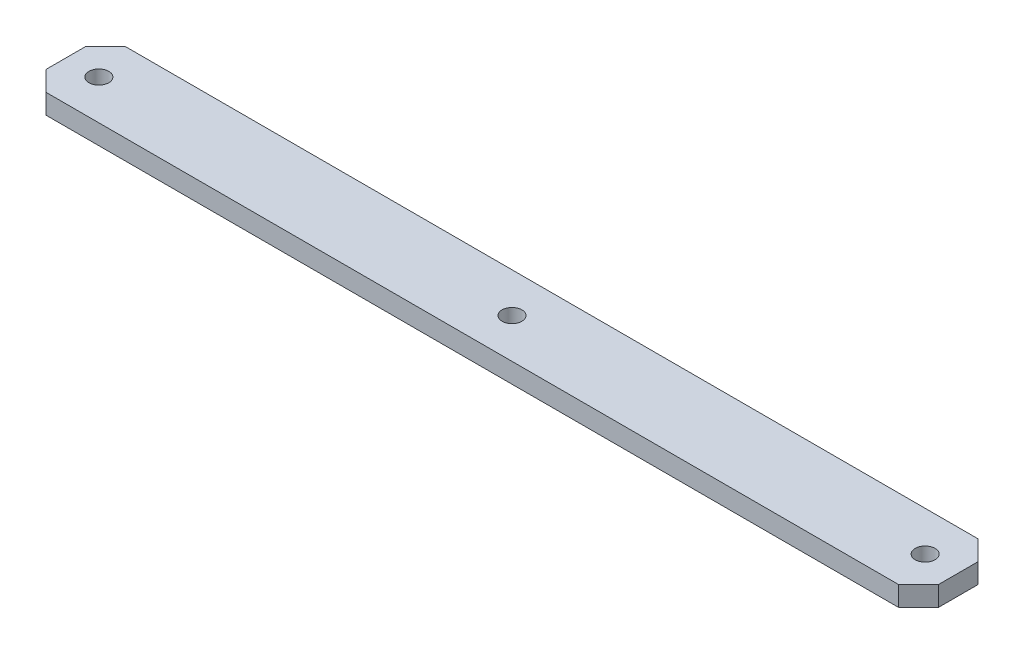
ISO-10303-21;
HEADER;
FILE_DESCRIPTION(('STEP AP214'),'2;1');
FILE_NAME('part.step','',(''),(''),'','','');
FILE_SCHEMA(('AUTOMOTIVE_DESIGN { 1 0 10303 214 1 1 1 1 }'));
ENDSEC;
DATA;
#1=APPLICATION_CONTEXT('core data for automotive mechanical design processes');
#2=APPLICATION_PROTOCOL_DEFINITION('international standard','automotive_design',2000,#1);
#3=PRODUCT_CONTEXT('',#1,'mechanical');
#4=PRODUCT('Part','Part','',(#3));
#5=PRODUCT_RELATED_PRODUCT_CATEGORY('part','',(#4));
#6=PRODUCT_DEFINITION_FORMATION('','',#4);
#7=PRODUCT_DEFINITION_CONTEXT('part definition',#1,'design');
#8=PRODUCT_DEFINITION('design','',#6,#7);
#9=PRODUCT_DEFINITION_SHAPE('','',#8);
#10=(LENGTH_UNIT() NAMED_UNIT(*) SI_UNIT(.MILLI.,.METRE.));
#11=(NAMED_UNIT(*) PLANE_ANGLE_UNIT() SI_UNIT($,.RADIAN.));
#12=(NAMED_UNIT(*) SI_UNIT($,.STERADIAN.) SOLID_ANGLE_UNIT());
#13=UNCERTAINTY_MEASURE_WITH_UNIT(LENGTH_MEASURE(1.E-05),#10,'distance_accuracy_value','');
#14=(GEOMETRIC_REPRESENTATION_CONTEXT(3) GLOBAL_UNCERTAINTY_ASSIGNED_CONTEXT((#13)) GLOBAL_UNIT_ASSIGNED_CONTEXT((#10,
#11,#12)) REPRESENTATION_CONTEXT('',''));
#15=CARTESIAN_POINT('',(0.,0.,0.));
#16=DIRECTION('',(0.,0.,1.));
#17=DIRECTION('',(1.,0.,0.));
#18=AXIS2_PLACEMENT_3D('',#15,#16,#17);
#19=CARTESIAN_POINT('',(0.,3.,0.));
#20=DIRECTION('',(0.,-1.,0.));
#21=DIRECTION('',(0.,0.,-1.));
#22=AXIS2_PLACEMENT_3D('',#19,#20,#21);
#23=PLANE('',#22);
#24=DIRECTION('',(1.,0.,0.));
#25=VECTOR('',#24,1.);
#26=CARTESIAN_POINT('',(-64.5,3.,-6.));
#27=LINE('',#26,#25);
#28=CARTESIAN_POINT('',(-64.5,3.,-6.));
#29=VERTEX_POINT('',#28);
#30=CARTESIAN_POINT('',(64.5,3.,-6.));
#31=VERTEX_POINT('',#30);
#32=EDGE_CURVE('E237',#29,#31,#27,.T.);
#33=ORIENTED_EDGE('',*,*,#32,.F.);
#34=DIRECTION('',(0.707106781186546,0.,-0.707106781186549));
#35=VECTOR('',#34,1.);
#36=CARTESIAN_POINT('',(-67.5,3.,-3.));
#37=LINE('',#36,#35);
#38=CARTESIAN_POINT('',(-67.5,3.,-3.));
#39=VERTEX_POINT('',#38);
#40=EDGE_CURVE('E197',#39,#29,#37,.T.);
#41=ORIENTED_EDGE('',*,*,#40,.F.);
#42=DIRECTION('',(0.,0.,1.));
#43=VECTOR('',#42,1.);
#44=CARTESIAN_POINT('',(-67.5,3.,-3.));
#45=LINE('',#44,#43);
#46=CARTESIAN_POINT('',(-67.5,3.,3.));
#47=VERTEX_POINT('',#46);
#48=EDGE_CURVE('E191',#39,#47,#45,.T.);
#49=ORIENTED_EDGE('',*,*,#48,.T.);
#50=DIRECTION('',(0.707106781186546,0.,0.707106781186549));
#51=VECTOR('',#50,1.);
#52=CARTESIAN_POINT('',(-67.5,3.,3.));
#53=LINE('',#52,#51);
#54=CARTESIAN_POINT('',(-64.5,3.,6.));
#55=VERTEX_POINT('',#54);
#56=EDGE_CURVE('E195',#47,#55,#53,.T.);
#57=ORIENTED_EDGE('',*,*,#56,.T.);
#58=DIRECTION('',(1.,0.,0.));
#59=VECTOR('',#58,1.);
#60=CARTESIAN_POINT('',(-64.5,3.,6.));
#61=LINE('',#60,#59);
#62=CARTESIAN_POINT('',(64.5,3.,6.));
#63=VERTEX_POINT('',#62);
#64=EDGE_CURVE('E210',#55,#63,#61,.T.);
#65=ORIENTED_EDGE('',*,*,#64,.T.);
#66=DIRECTION('',(0.70710678118655,0.,-0.707106781186545));
#67=VECTOR('',#66,1.);
#68=CARTESIAN_POINT('',(64.5,3.,6.));
#69=LINE('',#68,#67);
#70=CARTESIAN_POINT('',(67.5,3.,3.));
#71=VERTEX_POINT('',#70);
#72=EDGE_CURVE('E212',#63,#71,#69,.T.);
#73=ORIENTED_EDGE('',*,*,#72,.T.);
#74=DIRECTION('',(0.,0.,1.));
#75=VECTOR('',#74,1.);
#76=CARTESIAN_POINT('',(67.5,3.,-3.));
#77=LINE('',#76,#75);
#78=CARTESIAN_POINT('',(67.5,3.,-3.));
#79=VERTEX_POINT('',#78);
#80=EDGE_CURVE('E305',#79,#71,#77,.T.);
#81=ORIENTED_EDGE('',*,*,#80,.F.);
#82=DIRECTION('',(0.707106781186549,0.,0.707106781186546));
#83=VECTOR('',#82,1.);
#84=CARTESIAN_POINT('',(64.5,3.,-6.));
#85=LINE('',#84,#83);
#86=EDGE_CURVE('E303',#31,#79,#85,.T.);
#87=ORIENTED_EDGE('',*,*,#86,.F.);
#88=EDGE_LOOP('',(#33,#41,#49,#57,#65,#73,#81,#87));
#89=FACE_BOUND('',#88,.T.);
#90=CARTESIAN_POINT('',(-62.5,3.,0.));
#91=DIRECTION('',(0.,1.,0.));
#92=DIRECTION('',(0.,0.,1.));
#93=AXIS2_PLACEMENT_3D('',#90,#91,#92);
#94=CIRCLE('',#93,1.5);
#95=CARTESIAN_POINT('',(-62.5,3.,1.5));
#96=VERTEX_POINT('',#95);
#97=EDGE_CURVE('E221',#96,#96,#94,.T.);
#98=ORIENTED_EDGE('',*,*,#97,.F.);
#99=EDGE_LOOP('',(#98));
#100=FACE_BOUND('',#99,.T.);
#101=CARTESIAN_POINT('',(0.,3.,0.));
#102=DIRECTION('',(0.,1.,0.));
#103=DIRECTION('',(0.,0.,1.));
#104=AXIS2_PLACEMENT_3D('',#101,#102,#103);
#105=CIRCLE('',#104,1.5);
#106=CARTESIAN_POINT('',(0.,3.,1.5));
#107=VERTEX_POINT('',#106);
#108=EDGE_CURVE('E292',#107,#107,#105,.T.);
#109=ORIENTED_EDGE('',*,*,#108,.F.);
#110=EDGE_LOOP('',(#109));
#111=FACE_BOUND('',#110,.T.);
#112=CARTESIAN_POINT('',(62.5,3.,0.));
#113=DIRECTION('',(0.,1.,0.));
#114=DIRECTION('',(0.,0.,1.));
#115=AXIS2_PLACEMENT_3D('',#112,#113,#114);
#116=CIRCLE('',#115,1.5);
#117=CARTESIAN_POINT('',(62.5,3.,1.5));
#118=VERTEX_POINT('',#117);
#119=EDGE_CURVE('E283',#118,#118,#116,.T.);
#120=ORIENTED_EDGE('',*,*,#119,.F.);
#121=EDGE_LOOP('',(#120));
#122=FACE_BOUND('',#121,.T.);
#123=ADVANCED_FACE('F120',(#89,#100,#111,#122),#23,.F.);
#124=CARTESIAN_POINT('',(0.,0.,0.));
#125=DIRECTION('',(0.,-1.,0.));
#126=DIRECTION('',(0.,0.,-1.));
#127=AXIS2_PLACEMENT_3D('',#124,#125,#126);
#128=PLANE('',#127);
#129=CARTESIAN_POINT('',(0.,0.,0.));
#130=DIRECTION('',(0.,1.,0.));
#131=DIRECTION('',(0.,0.,1.));
#132=AXIS2_PLACEMENT_3D('',#129,#130,#131);
#133=CIRCLE('',#132,1.5);
#134=CARTESIAN_POINT('',(0.,0.,1.5));
#135=VERTEX_POINT('',#134);
#136=EDGE_CURVE('E289',#135,#135,#133,.T.);
#137=ORIENTED_EDGE('',*,*,#136,.T.);
#138=EDGE_LOOP('',(#137));
#139=FACE_BOUND('',#138,.T.);
#140=DIRECTION('',(1.,0.,0.));
#141=VECTOR('',#140,1.);
#142=CARTESIAN_POINT('',(-64.5,0.,-6.));
#143=LINE('',#142,#141);
#144=CARTESIAN_POINT('',(-64.5,0.,-6.));
#145=VERTEX_POINT('',#144);
#146=CARTESIAN_POINT('',(64.5,0.,-6.));
#147=VERTEX_POINT('',#146);
#148=EDGE_CURVE('E217',#145,#147,#143,.T.);
#149=ORIENTED_EDGE('',*,*,#148,.T.);
#150=DIRECTION('',(0.707106781186549,0.,0.707106781186546));
#151=VECTOR('',#150,1.);
#152=CARTESIAN_POINT('',(64.5,0.,-6.));
#153=LINE('',#152,#151);
#154=CARTESIAN_POINT('',(67.5,0.,-3.));
#155=VERTEX_POINT('',#154);
#156=EDGE_CURVE('E220',#147,#155,#153,.T.);
#157=ORIENTED_EDGE('',*,*,#156,.T.);
#158=DIRECTION('',(0.,0.,1.));
#159=VECTOR('',#158,1.);
#160=CARTESIAN_POINT('',(67.5,0.,-3.));
#161=LINE('',#160,#159);
#162=CARTESIAN_POINT('',(67.5,0.,3.));
#163=VERTEX_POINT('',#162);
#164=EDGE_CURVE('E224',#155,#163,#161,.T.);
#165=ORIENTED_EDGE('',*,*,#164,.T.);
#166=DIRECTION('',(0.70710678118655,0.,-0.707106781186545));
#167=VECTOR('',#166,1.);
#168=CARTESIAN_POINT('',(64.5,0.,6.));
#169=LINE('',#168,#167);
#170=CARTESIAN_POINT('',(64.5,0.,6.));
#171=VERTEX_POINT('',#170);
#172=EDGE_CURVE('E227',#171,#163,#169,.T.);
#173=ORIENTED_EDGE('',*,*,#172,.F.);
#174=DIRECTION('',(1.,0.,0.));
#175=VECTOR('',#174,1.);
#176=CARTESIAN_POINT('',(-64.5,0.,6.));
#177=LINE('',#176,#175);
#178=CARTESIAN_POINT('',(-64.5,0.,6.));
#179=VERTEX_POINT('',#178);
#180=EDGE_CURVE('E230',#179,#171,#177,.T.);
#181=ORIENTED_EDGE('',*,*,#180,.F.);
#182=DIRECTION('',(0.707106781186546,0.,0.707106781186549));
#183=VECTOR('',#182,1.);
#184=CARTESIAN_POINT('',(-67.5,0.,3.));
#185=LINE('',#184,#183);
#186=CARTESIAN_POINT('',(-67.5,0.,3.));
#187=VERTEX_POINT('',#186);
#188=EDGE_CURVE('E232',#187,#179,#185,.T.);
#189=ORIENTED_EDGE('',*,*,#188,.F.);
#190=DIRECTION('',(0.,0.,1.));
#191=VECTOR('',#190,1.);
#192=CARTESIAN_POINT('',(-67.5,0.,-3.));
#193=LINE('',#192,#191);
#194=CARTESIAN_POINT('',(-67.5,0.,-3.));
#195=VERTEX_POINT('',#194);
#196=EDGE_CURVE('E202',#195,#187,#193,.T.);
#197=ORIENTED_EDGE('',*,*,#196,.F.);
#198=DIRECTION('',(0.707106781186546,0.,-0.707106781186549));
#199=VECTOR('',#198,1.);
#200=CARTESIAN_POINT('',(-67.5,0.,-3.));
#201=LINE('',#200,#199);
#202=EDGE_CURVE('E235',#195,#145,#201,.T.);
#203=ORIENTED_EDGE('',*,*,#202,.T.);
#204=EDGE_LOOP('',(#149,#157,#165,#173,#181,#189,#197,#203));
#205=FACE_BOUND('',#204,.T.);
#206=CARTESIAN_POINT('',(-62.5,0.,0.));
#207=DIRECTION('',(0.,1.,0.));
#208=DIRECTION('',(0.,0.,1.));
#209=AXIS2_PLACEMENT_3D('',#206,#207,#208);
#210=CIRCLE('',#209,1.5);
#211=CARTESIAN_POINT('',(-62.5,0.,1.5));
#212=VERTEX_POINT('',#211);
#213=EDGE_CURVE('E295',#212,#212,#210,.T.);
#214=ORIENTED_EDGE('',*,*,#213,.T.);
#215=EDGE_LOOP('',(#214));
#216=FACE_BOUND('',#215,.T.);
#217=CARTESIAN_POINT('',(62.5,0.,0.));
#218=DIRECTION('',(0.,1.,0.));
#219=DIRECTION('',(0.,0.,1.));
#220=AXIS2_PLACEMENT_3D('',#217,#218,#219);
#221=CIRCLE('',#220,1.5);
#222=CARTESIAN_POINT('',(62.5,0.,1.5));
#223=VERTEX_POINT('',#222);
#224=EDGE_CURVE('E286',#223,#223,#221,.T.);
#225=ORIENTED_EDGE('',*,*,#224,.T.);
#226=EDGE_LOOP('',(#225));
#227=FACE_BOUND('',#226,.T.);
#228=ADVANCED_FACE('F249',(#139,#205,#216,#227),#128,.T.);
#229=CARTESIAN_POINT('',(-64.5,3.,-6.));
#230=DIRECTION('',(0.,0.,-1.));
#231=DIRECTION('',(-1.,0.,0.));
#232=AXIS2_PLACEMENT_3D('',#229,#230,#231);
#233=PLANE('',#232);
#234=ORIENTED_EDGE('',*,*,#148,.F.);
#235=DIRECTION('',(0.,-1.,0.));
#236=VECTOR('',#235,1.);
#237=CARTESIAN_POINT('',(-64.5,3.,-6.));
#238=LINE('',#237,#236);
#239=EDGE_CURVE('E12',#29,#145,#238,.T.);
#240=ORIENTED_EDGE('',*,*,#239,.F.);
#241=ORIENTED_EDGE('',*,*,#32,.T.);
#242=DIRECTION('',(0.,-1.,0.));
#243=VECTOR('',#242,1.);
#244=CARTESIAN_POINT('',(64.5,3.,-6.));
#245=LINE('',#244,#243);
#246=EDGE_CURVE('E124',#31,#147,#245,.T.);
#247=ORIENTED_EDGE('',*,*,#246,.T.);
#248=EDGE_LOOP('',(#234,#240,#241,#247));
#249=FACE_BOUND('',#248,.T.);
#250=ADVANCED_FACE('F122',(#249),#233,.T.);
#251=CARTESIAN_POINT('',(-67.5,3.,-3.));
#252=DIRECTION('',(-0.707106781186549,0.,-0.707106781186546));
#253=DIRECTION('',(-0.707106781186546,0.,0.707106781186549));
#254=AXIS2_PLACEMENT_3D('',#251,#252,#253);
#255=PLANE('',#254);
#256=ORIENTED_EDGE('',*,*,#202,.F.);
#257=DIRECTION('',(0.,-1.,0.));
#258=VECTOR('',#257,1.);
#259=CARTESIAN_POINT('',(-67.5,3.,-3.));
#260=LINE('',#259,#258);
#261=EDGE_CURVE('E130',#39,#195,#260,.T.);
#262=ORIENTED_EDGE('',*,*,#261,.F.);
#263=ORIENTED_EDGE('',*,*,#40,.T.);
#264=ORIENTED_EDGE('',*,*,#239,.T.);
#265=EDGE_LOOP('',(#256,#262,#263,#264));
#266=FACE_BOUND('',#265,.T.);
#267=ADVANCED_FACE('F251',(#266),#255,.T.);
#268=CARTESIAN_POINT('',(-67.5,3.,-3.));
#269=DIRECTION('',(1.,0.,0.));
#270=DIRECTION('',(0.,0.,-1.));
#271=AXIS2_PLACEMENT_3D('',#268,#269,#270);
#272=PLANE('',#271);
#273=ORIENTED_EDGE('',*,*,#196,.T.);
#274=DIRECTION('',(0.,-1.,0.));
#275=VECTOR('',#274,1.);
#276=CARTESIAN_POINT('',(-67.5,3.,3.));
#277=LINE('',#276,#275);
#278=EDGE_CURVE('E200',#47,#187,#277,.T.);
#279=ORIENTED_EDGE('',*,*,#278,.F.);
#280=ORIENTED_EDGE('',*,*,#48,.F.);
#281=ORIENTED_EDGE('',*,*,#261,.T.);
#282=EDGE_LOOP('',(#273,#279,#280,#281));
#283=FACE_BOUND('',#282,.T.);
#284=ADVANCED_FACE('F201',(#283),#272,.F.);
#285=CARTESIAN_POINT('',(-67.5,3.,3.));
#286=DIRECTION('',(0.707106781186549,0.,-0.707106781186546));
#287=DIRECTION('',(-0.707106781186546,0.,-0.707106781186549));
#288=AXIS2_PLACEMENT_3D('',#285,#286,#287);
#289=PLANE('',#288);
#290=ORIENTED_EDGE('',*,*,#188,.T.);
#291=DIRECTION('',(0.,-1.,0.));
#292=VECTOR('',#291,1.);
#293=CARTESIAN_POINT('',(-64.5,3.,6.));
#294=LINE('',#293,#292);
#295=EDGE_CURVE('E205',#55,#179,#294,.T.);
#296=ORIENTED_EDGE('',*,*,#295,.F.);
#297=ORIENTED_EDGE('',*,*,#56,.F.);
#298=ORIENTED_EDGE('',*,*,#278,.T.);
#299=EDGE_LOOP('',(#290,#296,#297,#298));
#300=FACE_BOUND('',#299,.T.);
#301=ADVANCED_FACE('F207',(#300),#289,.F.);
#302=CARTESIAN_POINT('',(-64.5,3.,6.));
#303=DIRECTION('',(0.,0.,-1.));
#304=DIRECTION('',(-1.,0.,0.));
#305=AXIS2_PLACEMENT_3D('',#302,#303,#304);
#306=PLANE('',#305);
#307=ORIENTED_EDGE('',*,*,#180,.T.);
#308=DIRECTION('',(0.,-1.,0.));
#309=VECTOR('',#308,1.);
#310=CARTESIAN_POINT('',(64.5,3.,6.));
#311=LINE('',#310,#309);
#312=EDGE_CURVE('E241',#63,#171,#311,.T.);
#313=ORIENTED_EDGE('',*,*,#312,.F.);
#314=ORIENTED_EDGE('',*,*,#64,.F.);
#315=ORIENTED_EDGE('',*,*,#295,.T.);
#316=EDGE_LOOP('',(#307,#313,#314,#315));
#317=FACE_BOUND('',#316,.T.);
#318=ADVANCED_FACE('F318',(#317),#306,.F.);
#319=CARTESIAN_POINT('',(64.5,3.,6.));
#320=DIRECTION('',(-0.707106781186545,0.,-0.707106781186549));
#321=DIRECTION('',(-0.70710678118655,0.,0.707106781186545));
#322=AXIS2_PLACEMENT_3D('',#319,#320,#321);
#323=PLANE('',#322);
#324=ORIENTED_EDGE('',*,*,#172,.T.);
#325=DIRECTION('',(0.,-1.,0.));
#326=VECTOR('',#325,1.);
#327=CARTESIAN_POINT('',(67.5,3.,3.));
#328=LINE('',#327,#326);
#329=EDGE_CURVE('E244',#71,#163,#328,.T.);
#330=ORIENTED_EDGE('',*,*,#329,.F.);
#331=ORIENTED_EDGE('',*,*,#72,.F.);
#332=ORIENTED_EDGE('',*,*,#312,.T.);
#333=EDGE_LOOP('',(#324,#330,#331,#332));
#334=FACE_BOUND('',#333,.T.);
#335=ADVANCED_FACE('F312',(#334),#323,.F.);
#336=CARTESIAN_POINT('',(67.5,3.,-3.));
#337=DIRECTION('',(1.,0.,0.));
#338=DIRECTION('',(0.,0.,-1.));
#339=AXIS2_PLACEMENT_3D('',#336,#337,#338);
#340=PLANE('',#339);
#341=ORIENTED_EDGE('',*,*,#164,.F.);
#342=DIRECTION('',(0.,-1.,0.));
#343=VECTOR('',#342,1.);
#344=CARTESIAN_POINT('',(67.5,3.,-3.));
#345=LINE('',#344,#343);
#346=EDGE_CURVE('E245',#79,#155,#345,.T.);
#347=ORIENTED_EDGE('',*,*,#346,.F.);
#348=ORIENTED_EDGE('',*,*,#80,.T.);
#349=ORIENTED_EDGE('',*,*,#329,.T.);
#350=EDGE_LOOP('',(#341,#347,#348,#349));
#351=FACE_BOUND('',#350,.T.);
#352=ADVANCED_FACE('F315',(#351),#340,.T.);
#353=CARTESIAN_POINT('',(64.5,3.,-6.));
#354=DIRECTION('',(0.707106781186546,0.,-0.707106781186549));
#355=DIRECTION('',(-0.707106781186549,0.,-0.707106781186546));
#356=AXIS2_PLACEMENT_3D('',#353,#354,#355);
#357=PLANE('',#356);
#358=ORIENTED_EDGE('',*,*,#156,.F.);
#359=ORIENTED_EDGE('',*,*,#246,.F.);
#360=ORIENTED_EDGE('',*,*,#86,.T.);
#361=ORIENTED_EDGE('',*,*,#346,.T.);
#362=EDGE_LOOP('',(#358,#359,#360,#361));
#363=FACE_BOUND('',#362,.T.);
#364=ADVANCED_FACE('F247',(#363),#357,.T.);
#365=CARTESIAN_POINT('',(-62.5,3.,0.));
#366=DIRECTION('',(0.,-1.,0.));
#367=DIRECTION('',(0.,0.,-1.));
#368=AXIS2_PLACEMENT_3D('',#365,#366,#367);
#369=CYLINDRICAL_SURFACE('',#368,1.5);
#370=ORIENTED_EDGE('',*,*,#97,.T.);
#371=EDGE_LOOP('',(#370));
#372=FACE_BOUND('',#371,.T.);
#373=ORIENTED_EDGE('',*,*,#213,.F.);
#374=EDGE_LOOP('',(#373));
#375=FACE_BOUND('',#374,.T.);
#376=ADVANCED_FACE('F267',(#372,#375),#369,.F.);
#377=CARTESIAN_POINT('',(0.,3.,0.));
#378=DIRECTION('',(0.,-1.,0.));
#379=DIRECTION('',(0.,0.,-1.));
#380=AXIS2_PLACEMENT_3D('',#377,#378,#379);
#381=CYLINDRICAL_SURFACE('',#380,1.5);
#382=ORIENTED_EDGE('',*,*,#108,.T.);
#383=EDGE_LOOP('',(#382));
#384=FACE_BOUND('',#383,.T.);
#385=ORIENTED_EDGE('',*,*,#136,.F.);
#386=EDGE_LOOP('',(#385));
#387=FACE_BOUND('',#386,.T.);
#388=ADVANCED_FACE('F270',(#384,#387),#381,.F.);
#389=CARTESIAN_POINT('',(62.5,3.,0.));
#390=DIRECTION('',(0.,-1.,0.));
#391=DIRECTION('',(0.,0.,-1.));
#392=AXIS2_PLACEMENT_3D('',#389,#390,#391);
#393=CYLINDRICAL_SURFACE('',#392,1.5);
#394=ORIENTED_EDGE('',*,*,#119,.T.);
#395=EDGE_LOOP('',(#394));
#396=FACE_BOUND('',#395,.T.);
#397=ORIENTED_EDGE('',*,*,#224,.F.);
#398=EDGE_LOOP('',(#397));
#399=FACE_BOUND('',#398,.T.);
#400=ADVANCED_FACE('F274',(#396,#399),#393,.F.);
#401=CLOSED_SHELL('',(#123,#228,#250,#267,#284,#301,#318,#335,#352,#364,#376,#388,#400));
#402=MANIFOLD_SOLID_BREP('B2',#401);
#403=ADVANCED_BREP_SHAPE_REPRESENTATION('',(#18,#402),#14);
#404=SHAPE_DEFINITION_REPRESENTATION(#9,#403);
ENDSEC;
END-ISO-10303-21;
